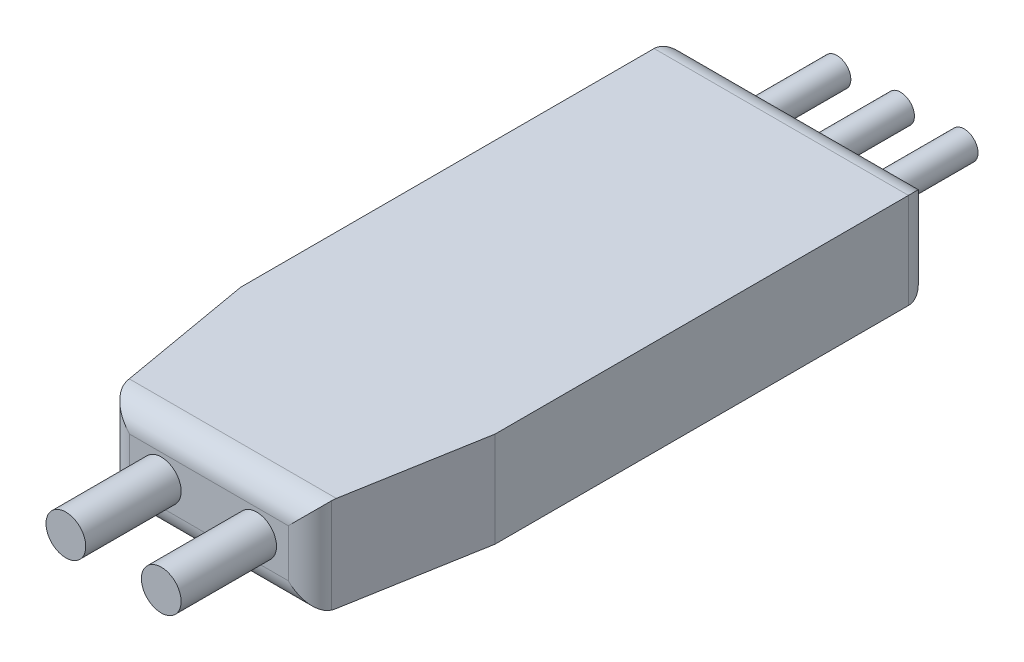
ISO-10303-21;
HEADER;
FILE_DESCRIPTION(('STEP AP214'),'2;1');
FILE_NAME('part.step','',(''),(''),'','','');
FILE_SCHEMA(('AUTOMOTIVE_DESIGN { 1 0 10303 214 1 1 1 1 }'));
ENDSEC;
DATA;
#1=APPLICATION_CONTEXT('core data for automotive mechanical design processes');
#2=APPLICATION_PROTOCOL_DEFINITION('international standard','automotive_design',2000,#1);
#3=PRODUCT_CONTEXT('',#1,'mechanical');
#4=PRODUCT('Part','Part','',(#3));
#5=PRODUCT_RELATED_PRODUCT_CATEGORY('part','',(#4));
#6=PRODUCT_DEFINITION_FORMATION('','',#4);
#7=PRODUCT_DEFINITION_CONTEXT('part definition',#1,'design');
#8=PRODUCT_DEFINITION('design','',#6,#7);
#9=PRODUCT_DEFINITION_SHAPE('','',#8);
#10=(LENGTH_UNIT() NAMED_UNIT(*) SI_UNIT(.MILLI.,.METRE.));
#11=(NAMED_UNIT(*) PLANE_ANGLE_UNIT() SI_UNIT($,.RADIAN.));
#12=(NAMED_UNIT(*) SI_UNIT($,.STERADIAN.) SOLID_ANGLE_UNIT());
#13=UNCERTAINTY_MEASURE_WITH_UNIT(LENGTH_MEASURE(1.E-05),#10,'distance_accuracy_value','');
#14=(GEOMETRIC_REPRESENTATION_CONTEXT(3) GLOBAL_UNCERTAINTY_ASSIGNED_CONTEXT((#13)) GLOBAL_UNIT_ASSIGNED_CONTEXT((#10,
#11,#12)) REPRESENTATION_CONTEXT('',''));
#15=CARTESIAN_POINT('',(0.,0.,0.));
#16=DIRECTION('',(0.,0.,1.));
#17=DIRECTION('',(1.,0.,0.));
#18=AXIS2_PLACEMENT_3D('',#15,#16,#17);
#19=CARTESIAN_POINT('',(-16.,12.,0.));
#20=DIRECTION('',(1.,0.,0.));
#21=DIRECTION('',(0.,0.,-1.));
#22=AXIS2_PLACEMENT_3D('',#19,#20,#21);
#23=PLANE('',#22);
#24=DIRECTION('',(0.,0.,1.));
#25=VECTOR('',#24,1.);
#26=CARTESIAN_POINT('',(-16.,12.,0.));
#27=LINE('',#26,#25);
#28=CARTESIAN_POINT('',(-16.,12.,-24.5));
#29=VERTEX_POINT('',#28);
#30=CARTESIAN_POINT('',(-16.,12.,27.5));
#31=VERTEX_POINT('',#30);
#32=EDGE_CURVE('E173',#29,#31,#27,.T.);
#33=ORIENTED_EDGE('',*,*,#32,.F.);
#34=DIRECTION('',(0.,-1.,0.));
#35=VECTOR('',#34,1.);
#36=CARTESIAN_POINT('',(-16.,0.,-24.5));
#37=LINE('',#36,#35);
#38=CARTESIAN_POINT('',(-16.,0.,-24.5));
#39=VERTEX_POINT('',#38);
#40=EDGE_CURVE('E142',#29,#39,#37,.T.);
#41=ORIENTED_EDGE('',*,*,#40,.T.);
#42=DIRECTION('',(0.,0.,1.));
#43=VECTOR('',#42,1.);
#44=CARTESIAN_POINT('',(-16.,0.,0.));
#45=LINE('',#44,#43);
#46=CARTESIAN_POINT('',(-16.,0.,27.5));
#47=VERTEX_POINT('',#46);
#48=EDGE_CURVE('E137',#39,#47,#45,.T.);
#49=ORIENTED_EDGE('',*,*,#48,.T.);
#50=DIRECTION('',(0.,-1.,0.));
#51=VECTOR('',#50,1.);
#52=CARTESIAN_POINT('',(-16.,12.,27.5));
#53=LINE('',#52,#51);
#54=EDGE_CURVE('E140',#31,#47,#53,.T.);
#55=ORIENTED_EDGE('',*,*,#54,.F.);
#56=EDGE_LOOP('',(#33,#41,#49,#55));
#57=FACE_BOUND('',#56,.T.);
#58=ADVANCED_FACE('F44',(#57),#23,.F.);
#59=CARTESIAN_POINT('',(16.,12.,0.));
#60=DIRECTION('',(1.,0.,0.));
#61=DIRECTION('',(0.,0.,-1.));
#62=AXIS2_PLACEMENT_3D('',#59,#60,#61);
#63=PLANE('',#62);
#64=DIRECTION('',(0.,0.,1.));
#65=VECTOR('',#64,1.);
#66=CARTESIAN_POINT('',(16.,0.,0.));
#67=LINE('',#66,#65);
#68=CARTESIAN_POINT('',(16.,0.,-24.5));
#69=VERTEX_POINT('',#68);
#70=CARTESIAN_POINT('',(16.,0.,27.5));
#71=VERTEX_POINT('',#70);
#72=EDGE_CURVE('E145',#69,#71,#67,.T.);
#73=ORIENTED_EDGE('',*,*,#72,.F.);
#74=DIRECTION('',(0.,-1.,0.));
#75=VECTOR('',#74,1.);
#76=CARTESIAN_POINT('',(16.,12.,-24.5));
#77=LINE('',#76,#75);
#78=CARTESIAN_POINT('',(16.,12.,-24.5));
#79=VERTEX_POINT('',#78);
#80=EDGE_CURVE('E11',#69,#79,#77,.F.);
#81=ORIENTED_EDGE('',*,*,#80,.T.);
#82=DIRECTION('',(0.,0.,1.));
#83=VECTOR('',#82,1.);
#84=CARTESIAN_POINT('',(16.,12.,0.));
#85=LINE('',#84,#83);
#86=CARTESIAN_POINT('',(16.,12.,27.5));
#87=VERTEX_POINT('',#86);
#88=EDGE_CURVE('E175',#79,#87,#85,.T.);
#89=ORIENTED_EDGE('',*,*,#88,.T.);
#90=DIRECTION('',(0.,-1.,0.));
#91=VECTOR('',#90,1.);
#92=CARTESIAN_POINT('',(16.,12.,27.5));
#93=LINE('',#92,#91);
#94=EDGE_CURVE('E155',#87,#71,#93,.T.);
#95=ORIENTED_EDGE('',*,*,#94,.T.);
#96=EDGE_LOOP('',(#73,#81,#89,#95));
#97=FACE_BOUND('',#96,.T.);
#98=ADVANCED_FACE('F254',(#97),#63,.T.);
#99=CARTESIAN_POINT('',(0.,12.,-27.5));
#100=DIRECTION('',(0.,0.,-1.));
#101=DIRECTION('',(-1.,0.,0.));
#102=AXIS2_PLACEMENT_3D('',#99,#100,#101);
#103=PLANE('',#102);
#104=DIRECTION('',(1.,0.,0.));
#105=VECTOR('',#104,1.);
#106=CARTESIAN_POINT('',(-16.,3.,-27.5));
#107=LINE('',#106,#105);
#108=CARTESIAN_POINT('',(13.,3.,-27.5));
#109=VERTEX_POINT('',#108);
#110=CARTESIAN_POINT('',(-13.,3.,-27.5));
#111=VERTEX_POINT('',#110);
#112=EDGE_CURVE('E61',#109,#111,#107,.F.);
#113=ORIENTED_EDGE('',*,*,#112,.T.);
#114=DIRECTION('',(0.,-1.,0.));
#115=VECTOR('',#114,1.);
#116=CARTESIAN_POINT('',(-13.,12.,-27.5));
#117=LINE('',#116,#115);
#118=CARTESIAN_POINT('',(-13.,9.,-27.5));
#119=VERTEX_POINT('',#118);
#120=EDGE_CURVE('E53',#111,#119,#117,.F.);
#121=ORIENTED_EDGE('',*,*,#120,.T.);
#122=DIRECTION('',(1.,0.,0.));
#123=VECTOR('',#122,1.);
#124=CARTESIAN_POINT('',(0.,9.,-27.5));
#125=LINE('',#124,#123);
#126=CARTESIAN_POINT('',(13.,9.,-27.5));
#127=VERTEX_POINT('',#126);
#128=EDGE_CURVE('E216',#119,#127,#125,.T.);
#129=ORIENTED_EDGE('',*,*,#128,.T.);
#130=DIRECTION('',(0.,-1.,0.));
#131=VECTOR('',#130,1.);
#132=CARTESIAN_POINT('',(13.,12.,-27.5));
#133=LINE('',#132,#131);
#134=EDGE_CURVE('E214',#127,#109,#133,.T.);
#135=ORIENTED_EDGE('',*,*,#134,.T.);
#136=EDGE_LOOP('',(#113,#121,#129,#135));
#137=FACE_BOUND('',#136,.T.);
#138=CARTESIAN_POINT('',(8.,5.99999999999994,-27.5));
#139=DIRECTION('',(0.,0.,-1.));
#140=DIRECTION('',(-1.,0.,0.));
#141=AXIS2_PLACEMENT_3D('',#138,#139,#140);
#142=CIRCLE('',#141,1.75);
#143=CARTESIAN_POINT('',(6.25,5.99999999999994,-27.5));
#144=VERTEX_POINT('',#143);
#145=EDGE_CURVE('E231',#144,#144,#142,.T.);
#146=ORIENTED_EDGE('',*,*,#145,.F.);
#147=EDGE_LOOP('',(#146));
#148=FACE_BOUND('',#147,.T.);
#149=CARTESIAN_POINT('',(0.,6.,-27.5));
#150=DIRECTION('',(0.,0.,-1.));
#151=DIRECTION('',(-1.,0.,0.));
#152=AXIS2_PLACEMENT_3D('',#149,#150,#151);
#153=CIRCLE('',#152,1.75);
#154=CARTESIAN_POINT('',(-1.75,6.,-27.5));
#155=VERTEX_POINT('',#154);
#156=EDGE_CURVE('E290',#155,#155,#153,.T.);
#157=ORIENTED_EDGE('',*,*,#156,.F.);
#158=EDGE_LOOP('',(#157));
#159=FACE_BOUND('',#158,.T.);
#160=CARTESIAN_POINT('',(-8.,6.,-27.5));
#161=DIRECTION('',(0.,0.,-1.));
#162=DIRECTION('',(-1.,0.,0.));
#163=AXIS2_PLACEMENT_3D('',#160,#161,#162);
#164=CIRCLE('',#163,1.75);
#165=CARTESIAN_POINT('',(-9.75,6.,-27.5));
#166=VERTEX_POINT('',#165);
#167=EDGE_CURVE('E284',#166,#166,#164,.T.);
#168=ORIENTED_EDGE('',*,*,#167,.F.);
#169=EDGE_LOOP('',(#168));
#170=FACE_BOUND('',#169,.T.);
#171=ADVANCED_FACE('F247',(#137,#148,#159,#170),#103,.T.);
#172=CARTESIAN_POINT('',(0.,12.,0.));
#173=DIRECTION('',(0.,1.,0.));
#174=DIRECTION('',(0.,0.,1.));
#175=AXIS2_PLACEMENT_3D('',#172,#173,#174);
#176=PLANE('',#175);
#177=DIRECTION('',(0.172380331752248,0.,0.985030467155704));
#178=VECTOR('',#177,1.);
#179=CARTESIAN_POINT('',(-20.194057004245,12.,3.53395997574287));
#180=LINE('',#179,#178);
#181=CARTESIAN_POINT('',(-13.025,12.,44.5));
#182=VERTEX_POINT('',#181);
#183=EDGE_CURVE('E153',#31,#182,#180,.T.);
#184=ORIENTED_EDGE('',*,*,#183,.T.);
#185=DIRECTION('',(1.,0.,0.));
#186=VECTOR('',#185,1.);
#187=CARTESIAN_POINT('',(12.5,12.,44.5));
#188=LINE('',#187,#186);
#189=CARTESIAN_POINT('',(13.025,12.,44.5));
#190=VERTEX_POINT('',#189);
#191=EDGE_CURVE('E211',#182,#190,#188,.T.);
#192=ORIENTED_EDGE('',*,*,#191,.T.);
#193=DIRECTION('',(0.172380331752248,0.,-0.985030467155704));
#194=VECTOR('',#193,1.);
#195=CARTESIAN_POINT('',(20.194057004245,12.,3.53395997574287));
#196=LINE('',#195,#194);
#197=EDGE_CURVE('E146',#190,#87,#196,.T.);
#198=ORIENTED_EDGE('',*,*,#197,.T.);
#199=ORIENTED_EDGE('',*,*,#88,.F.);
#200=DIRECTION('',(1.,0.,0.));
#201=VECTOR('',#200,1.);
#202=CARTESIAN_POINT('',(0.,12.,-24.5));
#203=LINE('',#202,#201);
#204=EDGE_CURVE('E209',#79,#29,#203,.F.);
#205=ORIENTED_EDGE('',*,*,#204,.T.);
#206=ORIENTED_EDGE('',*,*,#32,.T.);
#207=EDGE_LOOP('',(#184,#192,#198,#199,#205,#206));
#208=FACE_BOUND('',#207,.T.);
#209=ADVANCED_FACE('F279',(#208),#176,.T.);
#210=CARTESIAN_POINT('',(0.,0.,0.));
#211=DIRECTION('',(0.,1.,0.));
#212=DIRECTION('',(0.,0.,1.));
#213=AXIS2_PLACEMENT_3D('',#210,#211,#212);
#214=PLANE('',#213);
#215=DIRECTION('',(0.172380331752248,0.,-0.985030467155704));
#216=VECTOR('',#215,1.);
#217=CARTESIAN_POINT('',(20.194057004245,0.,3.53395997574287));
#218=LINE('',#217,#216);
#219=CARTESIAN_POINT('',(13.025,0.,44.5));
#220=VERTEX_POINT('',#219);
#221=EDGE_CURVE('E162',#220,#71,#218,.T.);
#222=ORIENTED_EDGE('',*,*,#221,.F.);
#223=DIRECTION('',(1.,0.,0.));
#224=VECTOR('',#223,1.);
#225=CARTESIAN_POINT('',(0.,0.,44.5));
#226=LINE('',#225,#224);
#227=CARTESIAN_POINT('',(-13.025,0.,44.5));
#228=VERTEX_POINT('',#227);
#229=EDGE_CURVE('E161',#220,#228,#226,.F.);
#230=ORIENTED_EDGE('',*,*,#229,.T.);
#231=DIRECTION('',(0.172380331752248,0.,0.985030467155704));
#232=VECTOR('',#231,1.);
#233=CARTESIAN_POINT('',(-20.194057004245,0.,3.53395997574287));
#234=LINE('',#233,#232);
#235=EDGE_CURVE('E151',#47,#228,#234,.T.);
#236=ORIENTED_EDGE('',*,*,#235,.F.);
#237=ORIENTED_EDGE('',*,*,#48,.F.);
#238=DIRECTION('',(1.,0.,0.));
#239=VECTOR('',#238,1.);
#240=CARTESIAN_POINT('',(16.,0.,-24.5));
#241=LINE('',#240,#239);
#242=EDGE_CURVE('E200',#39,#69,#241,.T.);
#243=ORIENTED_EDGE('',*,*,#242,.T.);
#244=ORIENTED_EDGE('',*,*,#72,.T.);
#245=EDGE_LOOP('',(#222,#230,#236,#237,#243,#244));
#246=FACE_BOUND('',#245,.T.);
#247=ADVANCED_FACE('F159',(#246),#214,.F.);
#248=CARTESIAN_POINT('',(-20.194057004245,12.,3.53395997574287));
#249=DIRECTION('',(0.985030467155704,0.,-0.172380331752248));
#250=DIRECTION('',(-0.172380331752248,0.,-0.985030467155704));
#251=AXIS2_PLACEMENT_3D('',#248,#249,#250);
#252=PLANE('',#251);
#253=ORIENTED_EDGE('',*,*,#235,.T.);
#254=CARTESIAN_POINT('',(-13.025,3.,44.5));
#255=DIRECTION('',(0.985030467155704,0.,-0.172380331752248));
#256=DIRECTION('',(0.172380331752248,0.,0.985030467155704));
#257=AXIS2_PLACEMENT_3D('',#254,#255,#256);
#258=ELLIPSE('',#257,3.04559107563704,3.);
#259=CARTESIAN_POINT('',(-12.9345003258301,0.0449085985328862,45.0171409952567));
#260=VERTEX_POINT('',#259);
#261=EDGE_CURVE('E207',#228,#260,#258,.F.);
#262=ORIENTED_EDGE('',*,*,#261,.T.);
#263=DIRECTION('',(0.,-1.,0.));
#264=VECTOR('',#263,1.);
#265=CARTESIAN_POINT('',(-12.9345003258301,12.,45.0171409952567));
#266=LINE('',#265,#264);
#267=CARTESIAN_POINT('',(-12.9345003258301,11.9550914014671,45.0171409952567));
#268=VERTEX_POINT('',#267);
#269=EDGE_CURVE('E205',#260,#268,#266,.F.);
#270=ORIENTED_EDGE('',*,*,#269,.T.);
#271=CARTESIAN_POINT('',(-13.025,9.,44.5));
#272=DIRECTION('',(0.985030467155704,0.,-0.172380331752248));
#273=DIRECTION('',(-0.172380331752248,0.,-0.985030467155704));
#274=AXIS2_PLACEMENT_3D('',#271,#272,#273);
#275=ELLIPSE('',#274,3.04559107563704,3.);
#276=EDGE_CURVE('E203',#268,#182,#275,.F.);
#277=ORIENTED_EDGE('',*,*,#276,.T.);
#278=ORIENTED_EDGE('',*,*,#183,.F.);
#279=ORIENTED_EDGE('',*,*,#54,.T.);
#280=EDGE_LOOP('',(#253,#262,#270,#277,#278,#279));
#281=FACE_BOUND('',#280,.T.);
#282=ADVANCED_FACE('F150',(#281),#252,.F.);
#283=CARTESIAN_POINT('',(0.,12.,47.5));
#284=DIRECTION('',(0.,0.,-1.));
#285=DIRECTION('',(-1.,0.,0.));
#286=AXIS2_PLACEMENT_3D('',#283,#284,#285);
#287=PLANE('',#286);
#288=DIRECTION('',(0.,-1.,0.));
#289=VECTOR('',#288,1.);
#290=CARTESIAN_POINT('',(-9.97940892436296,12.,47.5));
#291=LINE('',#290,#289);
#292=CARTESIAN_POINT('',(-9.97940892436296,9.,47.5));
#293=VERTEX_POINT('',#292);
#294=CARTESIAN_POINT('',(-9.97940892436296,3.,47.5));
#295=VERTEX_POINT('',#294);
#296=EDGE_CURVE('E189',#293,#295,#291,.T.);
#297=ORIENTED_EDGE('',*,*,#296,.T.);
#298=DIRECTION('',(1.,0.,0.));
#299=VECTOR('',#298,1.);
#300=CARTESIAN_POINT('',(0.,3.,47.5));
#301=LINE('',#300,#299);
#302=CARTESIAN_POINT('',(9.97940892436296,3.,47.5));
#303=VERTEX_POINT('',#302);
#304=EDGE_CURVE('E191',#295,#303,#301,.T.);
#305=ORIENTED_EDGE('',*,*,#304,.T.);
#306=DIRECTION('',(0.,-1.,0.));
#307=VECTOR('',#306,1.);
#308=CARTESIAN_POINT('',(9.97940892436296,12.,47.5));
#309=LINE('',#308,#307);
#310=CARTESIAN_POINT('',(9.97940892436296,9.,47.5));
#311=VERTEX_POINT('',#310);
#312=EDGE_CURVE('E185',#303,#311,#309,.F.);
#313=ORIENTED_EDGE('',*,*,#312,.T.);
#314=DIRECTION('',(1.,0.,0.));
#315=VECTOR('',#314,1.);
#316=CARTESIAN_POINT('',(-12.5,9.,47.5));
#317=LINE('',#316,#315);
#318=EDGE_CURVE('E187',#311,#293,#317,.F.);
#319=ORIENTED_EDGE('',*,*,#318,.T.);
#320=EDGE_LOOP('',(#297,#305,#313,#319));
#321=FACE_BOUND('',#320,.T.);
#322=CARTESIAN_POINT('',(-6.,6.,47.5));
#323=DIRECTION('',(0.,0.,-1.));
#324=DIRECTION('',(-1.,0.,0.));
#325=AXIS2_PLACEMENT_3D('',#322,#323,#324);
#326=CIRCLE('',#325,2.5);
#327=CARTESIAN_POINT('',(-8.5,6.,47.5));
#328=VERTEX_POINT('',#327);
#329=EDGE_CURVE('E182',#328,#328,#326,.F.);
#330=ORIENTED_EDGE('',*,*,#329,.F.);
#331=EDGE_LOOP('',(#330));
#332=FACE_BOUND('',#331,.T.);
#333=CARTESIAN_POINT('',(6.,6.,47.5));
#334=DIRECTION('',(0.,0.,-1.));
#335=DIRECTION('',(-1.,0.,0.));
#336=AXIS2_PLACEMENT_3D('',#333,#334,#335);
#337=CIRCLE('',#336,2.5);
#338=CARTESIAN_POINT('',(3.5,6.,47.5));
#339=VERTEX_POINT('',#338);
#340=EDGE_CURVE('E154',#339,#339,#337,.F.);
#341=ORIENTED_EDGE('',*,*,#340,.F.);
#342=EDGE_LOOP('',(#341));
#343=FACE_BOUND('',#342,.T.);
#344=ADVANCED_FACE('F467',(#321,#332,#343),#287,.F.);
#345=CARTESIAN_POINT('',(20.194057004245,12.,3.53395997574287));
#346=DIRECTION('',(-0.985030467155704,0.,-0.172380331752248));
#347=DIRECTION('',(-0.172380331752248,0.,0.985030467155704));
#348=AXIS2_PLACEMENT_3D('',#345,#346,#347);
#349=PLANE('',#348);
#350=DIRECTION('',(0.,-1.,0.));
#351=VECTOR('',#350,1.);
#352=CARTESIAN_POINT('',(12.9345003258301,12.,45.0171409952567));
#353=LINE('',#352,#351);
#354=CARTESIAN_POINT('',(12.9345003258301,11.9550914014671,45.0171409952567));
#355=VERTEX_POINT('',#354);
#356=CARTESIAN_POINT('',(12.9345003258301,0.0449085985328862,45.0171409952567));
#357=VERTEX_POINT('',#356);
#358=EDGE_CURVE('E194',#355,#357,#353,.T.);
#359=ORIENTED_EDGE('',*,*,#358,.T.);
#360=CARTESIAN_POINT('',(13.025,3.,44.5));
#361=DIRECTION('',(-0.985030467155704,0.,-0.172380331752248));
#362=DIRECTION('',(0.172380331752248,0.,-0.985030467155704));
#363=AXIS2_PLACEMENT_3D('',#360,#361,#362);
#364=ELLIPSE('',#363,3.04559107563704,3.);
#365=EDGE_CURVE('E198',#357,#220,#364,.F.);
#366=ORIENTED_EDGE('',*,*,#365,.T.);
#367=ORIENTED_EDGE('',*,*,#221,.T.);
#368=ORIENTED_EDGE('',*,*,#94,.F.);
#369=ORIENTED_EDGE('',*,*,#197,.F.);
#370=CARTESIAN_POINT('',(13.025,9.,44.5));
#371=DIRECTION('',(-0.985030467155704,0.,-0.172380331752248));
#372=DIRECTION('',(-0.172380331752248,0.,0.985030467155704));
#373=AXIS2_PLACEMENT_3D('',#370,#371,#372);
#374=ELLIPSE('',#373,3.04559107563704,3.);
#375=EDGE_CURVE('E196',#190,#355,#374,.F.);
#376=ORIENTED_EDGE('',*,*,#375,.T.);
#377=EDGE_LOOP('',(#359,#366,#367,#368,#369,#376));
#378=FACE_BOUND('',#377,.T.);
#379=ADVANCED_FACE('F260',(#378),#349,.F.);
#380=CARTESIAN_POINT('',(6.,6.,59.5));
#381=DIRECTION('',(0.,0.,-1.));
#382=DIRECTION('',(-1.,0.,0.));
#383=AXIS2_PLACEMENT_3D('',#380,#381,#382);
#384=CYLINDRICAL_SURFACE('',#383,2.5);
#385=CARTESIAN_POINT('',(6.,6.,59.5));
#386=DIRECTION('',(0.,0.,1.));
#387=DIRECTION('',(1.,0.,0.));
#388=AXIS2_PLACEMENT_3D('',#385,#386,#387);
#389=CIRCLE('',#388,2.5);
#390=CARTESIAN_POINT('',(8.5,6.,59.5));
#391=VERTEX_POINT('',#390);
#392=EDGE_CURVE('E163',#391,#391,#389,.T.);
#393=ORIENTED_EDGE('',*,*,#392,.F.);
#394=EDGE_LOOP('',(#393));
#395=FACE_BOUND('',#394,.T.);
#396=ORIENTED_EDGE('',*,*,#340,.T.);
#397=EDGE_LOOP('',(#396));
#398=FACE_BOUND('',#397,.T.);
#399=ADVANCED_FACE('F444',(#395,#398),#384,.T.);
#400=CARTESIAN_POINT('',(0.,0.,59.5));
#401=DIRECTION('',(0.,0.,1.));
#402=DIRECTION('',(1.,0.,0.));
#403=AXIS2_PLACEMENT_3D('',#400,#401,#402);
#404=PLANE('',#403);
#405=ORIENTED_EDGE('',*,*,#392,.T.);
#406=EDGE_LOOP('',(#405));
#407=FACE_BOUND('',#406,.T.);
#408=ADVANCED_FACE('F434',(#407),#404,.T.);
#409=CARTESIAN_POINT('',(-6.,6.,59.5));
#410=DIRECTION('',(0.,0.,-1.));
#411=DIRECTION('',(-1.,0.,0.));
#412=AXIS2_PLACEMENT_3D('',#409,#410,#411);
#413=CYLINDRICAL_SURFACE('',#412,2.5);
#414=CARTESIAN_POINT('',(-6.,6.,59.5));
#415=DIRECTION('',(0.,0.,1.));
#416=DIRECTION('',(1.,0.,0.));
#417=AXIS2_PLACEMENT_3D('',#414,#415,#416);
#418=CIRCLE('',#417,2.5);
#419=CARTESIAN_POINT('',(-3.5,6.,59.5));
#420=VERTEX_POINT('',#419);
#421=EDGE_CURVE('E168',#420,#420,#418,.T.);
#422=ORIENTED_EDGE('',*,*,#421,.F.);
#423=EDGE_LOOP('',(#422));
#424=FACE_BOUND('',#423,.T.);
#425=ORIENTED_EDGE('',*,*,#329,.T.);
#426=EDGE_LOOP('',(#425));
#427=FACE_BOUND('',#426,.T.);
#428=ADVANCED_FACE('F329',(#424,#427),#413,.T.);
#429=CARTESIAN_POINT('',(-6.,6.,59.5));
#430=DIRECTION('',(0.,0.,1.));
#431=DIRECTION('',(1.,0.,0.));
#432=AXIS2_PLACEMENT_3D('',#429,#430,#431);
#433=PLANE('',#432);
#434=ORIENTED_EDGE('',*,*,#421,.T.);
#435=EDGE_LOOP('',(#434));
#436=FACE_BOUND('',#435,.T.);
#437=ADVANCED_FACE('F319',(#436),#433,.T.);
#438=CARTESIAN_POINT('',(-8.,6.,-39.5));
#439=DIRECTION('',(0.,0.,1.));
#440=DIRECTION('',(1.,0.,0.));
#441=AXIS2_PLACEMENT_3D('',#438,#439,#440);
#442=CYLINDRICAL_SURFACE('',#441,1.75);
#443=CARTESIAN_POINT('',(-8.,6.,-39.5));
#444=DIRECTION('',(0.,0.,-1.));
#445=DIRECTION('',(-1.,0.,0.));
#446=AXIS2_PLACEMENT_3D('',#443,#444,#445);
#447=CIRCLE('',#446,1.75);
#448=CARTESIAN_POINT('',(-9.75,6.,-39.5));
#449=VERTEX_POINT('',#448);
#450=EDGE_CURVE('E283',#449,#449,#447,.T.);
#451=ORIENTED_EDGE('',*,*,#450,.F.);
#452=EDGE_LOOP('',(#451));
#453=FACE_BOUND('',#452,.T.);
#454=ORIENTED_EDGE('',*,*,#167,.T.);
#455=EDGE_LOOP('',(#454));
#456=FACE_BOUND('',#455,.T.);
#457=ADVANCED_FACE('F316',(#453,#456),#442,.T.);
#458=CARTESIAN_POINT('',(0.,0.,-39.5));
#459=DIRECTION('',(0.,0.,-1.));
#460=DIRECTION('',(-1.,0.,0.));
#461=AXIS2_PLACEMENT_3D('',#458,#459,#460);
#462=PLANE('',#461);
#463=ORIENTED_EDGE('',*,*,#450,.T.);
#464=EDGE_LOOP('',(#463));
#465=FACE_BOUND('',#464,.T.);
#466=ADVANCED_FACE('F318',(#465),#462,.T.);
#467=CARTESIAN_POINT('',(0.,6.,-39.5));
#468=DIRECTION('',(0.,0.,1.));
#469=DIRECTION('',(1.,0.,0.));
#470=AXIS2_PLACEMENT_3D('',#467,#468,#469);
#471=CYLINDRICAL_SURFACE('',#470,1.75);
#472=CARTESIAN_POINT('',(0.,6.,-39.5));
#473=DIRECTION('',(0.,0.,-1.));
#474=DIRECTION('',(-1.,0.,0.));
#475=AXIS2_PLACEMENT_3D('',#472,#473,#474);
#476=CIRCLE('',#475,1.75);
#477=CARTESIAN_POINT('',(-1.75,6.,-39.5));
#478=VERTEX_POINT('',#477);
#479=EDGE_CURVE('E287',#478,#478,#476,.T.);
#480=ORIENTED_EDGE('',*,*,#479,.F.);
#481=EDGE_LOOP('',(#480));
#482=FACE_BOUND('',#481,.T.);
#483=ORIENTED_EDGE('',*,*,#156,.T.);
#484=EDGE_LOOP('',(#483));
#485=FACE_BOUND('',#484,.T.);
#486=ADVANCED_FACE('F326',(#482,#485),#471,.T.);
#487=CARTESIAN_POINT('',(0.,0.,-39.5));
#488=DIRECTION('',(0.,0.,-1.));
#489=DIRECTION('',(-1.,0.,0.));
#490=AXIS2_PLACEMENT_3D('',#487,#488,#489);
#491=PLANE('',#490);
#492=ORIENTED_EDGE('',*,*,#479,.T.);
#493=EDGE_LOOP('',(#492));
#494=FACE_BOUND('',#493,.T.);
#495=ADVANCED_FACE('F306',(#494),#491,.T.);
#496=CARTESIAN_POINT('',(8.,5.99999999999994,-39.5));
#497=DIRECTION('',(0.,0.,1.));
#498=DIRECTION('',(1.,0.,0.));
#499=AXIS2_PLACEMENT_3D('',#496,#497,#498);
#500=CYLINDRICAL_SURFACE('',#499,1.75);
#501=CARTESIAN_POINT('',(8.,5.99999999999994,-39.5));
#502=DIRECTION('',(0.,0.,-1.));
#503=DIRECTION('',(-1.,0.,0.));
#504=AXIS2_PLACEMENT_3D('',#501,#502,#503);
#505=CIRCLE('',#504,1.75);
#506=CARTESIAN_POINT('',(6.25,5.99999999999994,-39.5));
#507=VERTEX_POINT('',#506);
#508=EDGE_CURVE('E293',#507,#507,#505,.T.);
#509=ORIENTED_EDGE('',*,*,#508,.F.);
#510=EDGE_LOOP('',(#509));
#511=FACE_BOUND('',#510,.T.);
#512=ORIENTED_EDGE('',*,*,#145,.T.);
#513=EDGE_LOOP('',(#512));
#514=FACE_BOUND('',#513,.T.);
#515=ADVANCED_FACE('F303',(#511,#514),#500,.T.);
#516=CARTESIAN_POINT('',(0.,0.,-39.5));
#517=DIRECTION('',(0.,0.,-1.));
#518=DIRECTION('',(-1.,0.,0.));
#519=AXIS2_PLACEMENT_3D('',#516,#517,#518);
#520=PLANE('',#519);
#521=ORIENTED_EDGE('',*,*,#508,.T.);
#522=EDGE_LOOP('',(#521));
#523=FACE_BOUND('',#522,.T.);
#524=ADVANCED_FACE('F301',(#523),#520,.T.);
#525=CARTESIAN_POINT('',(0.,9.,44.5));
#526=DIRECTION('',(-1.,0.,0.));
#527=DIRECTION('',(0.,0.,1.));
#528=AXIS2_PLACEMENT_3D('',#525,#526,#527);
#529=CYLINDRICAL_SURFACE('',#528,3.);
#530=ORIENTED_EDGE('',*,*,#191,.F.);
#531=ORIENTED_EDGE('',*,*,#276,.F.);
#532=CARTESIAN_POINT('',(-9.97940892436296,9.,44.5));
#533=DIRECTION('',(-0.707106781186548,-0.707106781186547,0.));
#534=DIRECTION('',(-0.707106781186548,0.707106781186547,0.));
#535=AXIS2_PLACEMENT_3D('',#532,#533,#534);
#536=ELLIPSE('',#535,4.24264068711928,3.);
#537=EDGE_CURVE('E228',#293,#268,#536,.T.);
#538=ORIENTED_EDGE('',*,*,#537,.F.);
#539=ORIENTED_EDGE('',*,*,#318,.F.);
#540=CARTESIAN_POINT('',(9.97940892436296,9.,44.5));
#541=DIRECTION('',(0.707106781186548,-0.707106781186547,0.));
#542=DIRECTION('',(-0.707106781186548,-0.707106781186547,0.));
#543=AXIS2_PLACEMENT_3D('',#540,#541,#542);
#544=ELLIPSE('',#543,4.24264068711928,3.);
#545=EDGE_CURVE('E225',#355,#311,#544,.T.);
#546=ORIENTED_EDGE('',*,*,#545,.F.);
#547=ORIENTED_EDGE('',*,*,#375,.F.);
#548=EDGE_LOOP('',(#530,#531,#538,#539,#546,#547));
#549=FACE_BOUND('',#548,.T.);
#550=ADVANCED_FACE('F276',(#549),#529,.T.);
#551=CARTESIAN_POINT('',(-9.97940892436296,12.,44.5));
#552=DIRECTION('',(0.,-1.,0.));
#553=DIRECTION('',(0.,0.,-1.));
#554=AXIS2_PLACEMENT_3D('',#551,#552,#553);
#555=CYLINDRICAL_SURFACE('',#554,3.);
#556=ORIENTED_EDGE('',*,*,#537,.T.);
#557=ORIENTED_EDGE('',*,*,#269,.F.);
#558=CARTESIAN_POINT('',(-9.97940892436296,3.,44.5));
#559=DIRECTION('',(0.707106781186548,-0.707106781186547,0.));
#560=DIRECTION('',(-0.707106781186548,-0.707106781186547,0.));
#561=AXIS2_PLACEMENT_3D('',#558,#559,#560);
#562=ELLIPSE('',#561,4.24264068711928,3.);
#563=EDGE_CURVE('E222',#295,#260,#562,.T.);
#564=ORIENTED_EDGE('',*,*,#563,.F.);
#565=ORIENTED_EDGE('',*,*,#296,.F.);
#566=EDGE_LOOP('',(#556,#557,#564,#565));
#567=FACE_BOUND('',#566,.T.);
#568=ADVANCED_FACE('F270',(#567),#555,.T.);
#569=CARTESIAN_POINT('',(9.97940892436296,12.,44.5));
#570=DIRECTION('',(0.,-1.,0.));
#571=DIRECTION('',(0.,0.,-1.));
#572=AXIS2_PLACEMENT_3D('',#569,#570,#571);
#573=CYLINDRICAL_SURFACE('',#572,3.);
#574=ORIENTED_EDGE('',*,*,#545,.T.);
#575=ORIENTED_EDGE('',*,*,#312,.F.);
#576=CARTESIAN_POINT('',(9.97940892436296,3.,44.5));
#577=DIRECTION('',(-0.707106781186548,-0.707106781186547,0.));
#578=DIRECTION('',(0.707106781186548,-0.707106781186547,0.));
#579=AXIS2_PLACEMENT_3D('',#576,#577,#578);
#580=ELLIPSE('',#579,4.24264068711928,3.);
#581=EDGE_CURVE('E220',#357,#303,#580,.T.);
#582=ORIENTED_EDGE('',*,*,#581,.F.);
#583=ORIENTED_EDGE('',*,*,#358,.F.);
#584=EDGE_LOOP('',(#574,#575,#582,#583));
#585=FACE_BOUND('',#584,.T.);
#586=ADVANCED_FACE('F343',(#585),#573,.T.);
#587=CARTESIAN_POINT('',(0.,3.,44.5));
#588=DIRECTION('',(1.,0.,0.));
#589=DIRECTION('',(0.,0.,-1.));
#590=AXIS2_PLACEMENT_3D('',#587,#588,#589);
#591=CYLINDRICAL_SURFACE('',#590,3.);
#592=ORIENTED_EDGE('',*,*,#261,.F.);
#593=ORIENTED_EDGE('',*,*,#229,.F.);
#594=ORIENTED_EDGE('',*,*,#365,.F.);
#595=ORIENTED_EDGE('',*,*,#581,.T.);
#596=ORIENTED_EDGE('',*,*,#304,.F.);
#597=ORIENTED_EDGE('',*,*,#563,.T.);
#598=EDGE_LOOP('',(#592,#593,#594,#595,#596,#597));
#599=FACE_BOUND('',#598,.T.);
#600=ADVANCED_FACE('F264',(#599),#591,.T.);
#601=CARTESIAN_POINT('',(13.,12.,-24.5));
#602=DIRECTION('',(0.,-1.,0.));
#603=DIRECTION('',(0.,0.,-1.));
#604=AXIS2_PLACEMENT_3D('',#601,#602,#603);
#605=CYLINDRICAL_SURFACE('',#604,3.);
#606=CARTESIAN_POINT('',(13.,3.,-24.5));
#607=DIRECTION('',(-0.707106781186547,-0.707106781186547,0.));
#608=DIRECTION('',(0.707106781186547,-0.707106781186547,0.));
#609=AXIS2_PLACEMENT_3D('',#606,#607,#608);
#610=ELLIPSE('',#609,4.24264068711928,3.);
#611=EDGE_CURVE('E234',#109,#69,#610,.T.);
#612=ORIENTED_EDGE('',*,*,#611,.F.);
#613=ORIENTED_EDGE('',*,*,#134,.F.);
#614=CARTESIAN_POINT('',(13.,9.,-24.5));
#615=DIRECTION('',(0.707106781186547,-0.707106781186547,0.));
#616=DIRECTION('',(-0.707106781186547,-0.707106781186547,0.));
#617=AXIS2_PLACEMENT_3D('',#614,#615,#616);
#618=ELLIPSE('',#617,4.24264068711928,3.);
#619=EDGE_CURVE('E48',#79,#127,#618,.F.);
#620=ORIENTED_EDGE('',*,*,#619,.F.);
#621=ORIENTED_EDGE('',*,*,#80,.F.);
#622=EDGE_LOOP('',(#612,#613,#620,#621));
#623=FACE_BOUND('',#622,.T.);
#624=ADVANCED_FACE('F46',(#623),#605,.T.);
#625=CARTESIAN_POINT('',(0.,9.,-24.5));
#626=DIRECTION('',(1.,0.,0.));
#627=DIRECTION('',(0.,0.,-1.));
#628=AXIS2_PLACEMENT_3D('',#625,#626,#627);
#629=CYLINDRICAL_SURFACE('',#628,3.);
#630=ORIENTED_EDGE('',*,*,#619,.T.);
#631=ORIENTED_EDGE('',*,*,#128,.F.);
#632=CARTESIAN_POINT('',(-13.,9.,-24.5));
#633=DIRECTION('',(0.707106781186547,0.707106781186547,0.));
#634=DIRECTION('',(0.707106781186547,-0.707106781186547,0.));
#635=AXIS2_PLACEMENT_3D('',#632,#633,#634);
#636=ELLIPSE('',#635,4.24264068711928,3.);
#637=EDGE_CURVE('E68',#29,#119,#636,.F.);
#638=ORIENTED_EDGE('',*,*,#637,.F.);
#639=ORIENTED_EDGE('',*,*,#204,.F.);
#640=EDGE_LOOP('',(#630,#631,#638,#639));
#641=FACE_BOUND('',#640,.T.);
#642=ADVANCED_FACE('F243',(#641),#629,.T.);
#643=CARTESIAN_POINT('',(0.,3.,-24.5));
#644=DIRECTION('',(-1.,0.,0.));
#645=DIRECTION('',(0.,0.,1.));
#646=AXIS2_PLACEMENT_3D('',#643,#644,#645);
#647=CYLINDRICAL_SURFACE('',#646,3.);
#648=ORIENTED_EDGE('',*,*,#611,.T.);
#649=ORIENTED_EDGE('',*,*,#242,.F.);
#650=CARTESIAN_POINT('',(-13.,3.,-24.5));
#651=DIRECTION('',(-0.707106781186547,0.707106781186547,0.));
#652=DIRECTION('',(-0.707106781186547,-0.707106781186547,0.));
#653=AXIS2_PLACEMENT_3D('',#650,#651,#652);
#654=ELLIPSE('',#653,4.24264068711928,3.);
#655=EDGE_CURVE('E232',#111,#39,#654,.T.);
#656=ORIENTED_EDGE('',*,*,#655,.F.);
#657=ORIENTED_EDGE('',*,*,#112,.F.);
#658=EDGE_LOOP('',(#648,#649,#656,#657));
#659=FACE_BOUND('',#658,.T.);
#660=ADVANCED_FACE('F251',(#659),#647,.T.);
#661=CARTESIAN_POINT('',(-13.,12.,-24.5));
#662=DIRECTION('',(0.,1.,0.));
#663=DIRECTION('',(0.,0.,1.));
#664=AXIS2_PLACEMENT_3D('',#661,#662,#663);
#665=CYLINDRICAL_SURFACE('',#664,3.);
#666=ORIENTED_EDGE('',*,*,#637,.T.);
#667=ORIENTED_EDGE('',*,*,#120,.F.);
#668=ORIENTED_EDGE('',*,*,#655,.T.);
#669=ORIENTED_EDGE('',*,*,#40,.F.);
#670=EDGE_LOOP('',(#666,#667,#668,#669));
#671=FACE_BOUND('',#670,.T.);
#672=ADVANCED_FACE('F250',(#671),#665,.T.);
#673=CLOSED_SHELL('',(#58,#98,#171,#209,#247,#282,#344,#379,#399,#408,#428,#437,#457,#466,#486,
#495,#515,#524,#550,#568,#586,#600,#624,#642,#660,#672));
#674=MANIFOLD_SOLID_BREP('B2',#673);
#675=ADVANCED_BREP_SHAPE_REPRESENTATION('',(#18,#674),#14);
#676=SHAPE_DEFINITION_REPRESENTATION(#9,#675);
ENDSEC;
END-ISO-10303-21;
